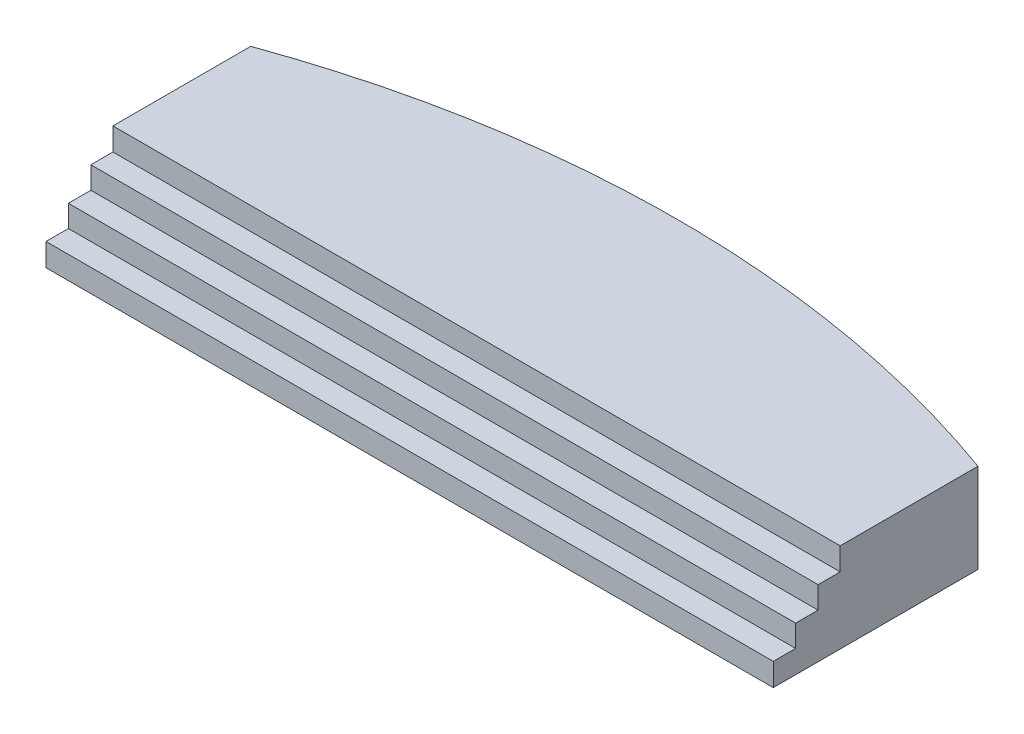
ISO-10303-21;
HEADER;
FILE_DESCRIPTION(('STEP AP214'),'2;1');
FILE_NAME('part.step','',(''),(''),'','','');
FILE_SCHEMA(('AUTOMOTIVE_DESIGN { 1 0 10303 214 1 1 1 1 }'));
ENDSEC;
DATA;
#1=APPLICATION_CONTEXT('core data for automotive mechanical design processes');
#2=APPLICATION_PROTOCOL_DEFINITION('international standard','automotive_design',2000,#1);
#3=PRODUCT_CONTEXT('',#1,'mechanical');
#4=PRODUCT('Part','Part','',(#3));
#5=PRODUCT_RELATED_PRODUCT_CATEGORY('part','',(#4));
#6=PRODUCT_DEFINITION_FORMATION('','',#4);
#7=PRODUCT_DEFINITION_CONTEXT('part definition',#1,'design');
#8=PRODUCT_DEFINITION('design','',#6,#7);
#9=PRODUCT_DEFINITION_SHAPE('','',#8);
#10=(LENGTH_UNIT() NAMED_UNIT(*) SI_UNIT(.MILLI.,.METRE.));
#11=(NAMED_UNIT(*) PLANE_ANGLE_UNIT() SI_UNIT($,.RADIAN.));
#12=(NAMED_UNIT(*) SI_UNIT($,.STERADIAN.) SOLID_ANGLE_UNIT());
#13=UNCERTAINTY_MEASURE_WITH_UNIT(LENGTH_MEASURE(1.E-05),#10,'distance_accuracy_value','');
#14=(GEOMETRIC_REPRESENTATION_CONTEXT(3) GLOBAL_UNCERTAINTY_ASSIGNED_CONTEXT((#13)) GLOBAL_UNIT_ASSIGNED_CONTEXT((#10,
#11,#12)) REPRESENTATION_CONTEXT('',''));
#15=CARTESIAN_POINT('',(0.,0.,0.));
#16=DIRECTION('',(0.,0.,1.));
#17=DIRECTION('',(1.,0.,0.));
#18=AXIS2_PLACEMENT_3D('',#15,#16,#17);
#19=CARTESIAN_POINT('',(-4067.11617207082,1000.,-9000.));
#20=DIRECTION('',(-1.,0.,0.));
#21=DIRECTION('',(0.,0.,1.));
#22=AXIS2_PLACEMENT_3D('',#19,#20,#21);
#23=PLANE('',#22);
#24=DIRECTION('',(0.,-1.,0.));
#25=VECTOR('',#24,1.);
#26=CARTESIAN_POINT('',(-4067.11617207082,1000.,-9748.52702002299));
#27=LINE('',#26,#25);
#28=CARTESIAN_POINT('',(-4067.11617207082,1000.,-9748.52702002299));
#29=VERTEX_POINT('',#28);
#30=CARTESIAN_POINT('',(-4067.11617207082,747.115103927776,-9748.52702002299));
#31=VERTEX_POINT('',#30);
#32=EDGE_CURVE('E185',#29,#31,#27,.T.);
#33=ORIENTED_EDGE('',*,*,#32,.F.);
#34=DIRECTION('',(0.,0.,-1.));
#35=VECTOR('',#34,1.);
#36=CARTESIAN_POINT('',(-4067.11617207082,1000.,-9000.));
#37=LINE('',#36,#35);
#38=CARTESIAN_POINT('',(-4067.11617207082,1000.,-11289.7549150936));
#39=VERTEX_POINT('',#38);
#40=EDGE_CURVE('E68',#29,#39,#37,.T.);
#41=ORIENTED_EDGE('',*,*,#40,.T.);
#42=DIRECTION('',(0.,-1.,0.));
#43=VECTOR('',#42,1.);
#44=CARTESIAN_POINT('',(-4067.11617207082,1000.,-11289.7549150936));
#45=LINE('',#44,#43);
#46=CARTESIAN_POINT('',(-4067.11617207082,0.,-11289.7549150936));
#47=VERTEX_POINT('',#46);
#48=EDGE_CURVE('E226',#39,#47,#45,.T.);
#49=ORIENTED_EDGE('',*,*,#48,.T.);
#50=DIRECTION('',(0.,0.,-1.));
#51=VECTOR('',#50,1.);
#52=CARTESIAN_POINT('',(-4067.11617207082,0.,-9000.));
#53=LINE('',#52,#51);
#54=CARTESIAN_POINT('',(-4067.11617207082,0.,-9000.));
#55=VERTEX_POINT('',#54);
#56=EDGE_CURVE('E139',#55,#47,#53,.T.);
#57=ORIENTED_EDGE('',*,*,#56,.F.);
#58=DIRECTION('',(0.,-1.,0.));
#59=VECTOR('',#58,1.);
#60=CARTESIAN_POINT('',(-4067.11617207082,1000.,-9000.));
#61=LINE('',#60,#59);
#62=CARTESIAN_POINT('',(-4067.11617207082,254.910429711032,-9000.));
#63=VERTEX_POINT('',#62);
#64=EDGE_CURVE('E219',#63,#55,#61,.T.);
#65=ORIENTED_EDGE('',*,*,#64,.F.);
#66=DIRECTION('',(0.,0.,1.));
#67=VECTOR('',#66,1.);
#68=CARTESIAN_POINT('',(-4067.11617207082,254.910429711032,-9000.));
#69=LINE('',#68,#67);
#70=CARTESIAN_POINT('',(-4067.11617207082,254.910429711032,-9250.24574488999));
#71=VERTEX_POINT('',#70);
#72=EDGE_CURVE('E202',#71,#63,#69,.T.);
#73=ORIENTED_EDGE('',*,*,#72,.F.);
#74=DIRECTION('',(0.,-1.,0.));
#75=VECTOR('',#74,1.);
#76=CARTESIAN_POINT('',(-4067.11617207082,1000.,-9250.24574488999));
#77=LINE('',#76,#75);
#78=CARTESIAN_POINT('',(-4067.11617207082,500.,-9250.24574488999));
#79=VERTEX_POINT('',#78);
#80=EDGE_CURVE('E205',#79,#71,#77,.T.);
#81=ORIENTED_EDGE('',*,*,#80,.F.);
#82=DIRECTION('',(0.,0.,1.));
#83=VECTOR('',#82,1.);
#84=CARTESIAN_POINT('',(-4067.11617207082,500.,-9000.));
#85=LINE('',#84,#83);
#86=CARTESIAN_POINT('',(-4067.11617207082,500.,-9501.41191609525));
#87=VERTEX_POINT('',#86);
#88=EDGE_CURVE('E208',#87,#79,#85,.T.);
#89=ORIENTED_EDGE('',*,*,#88,.F.);
#90=DIRECTION('',(0.,-1.,0.));
#91=VECTOR('',#90,1.);
#92=CARTESIAN_POINT('',(-4067.11617207082,1000.,-9501.41191609525));
#93=LINE('',#92,#91);
#94=CARTESIAN_POINT('',(-4067.11617207082,747.115103927776,-9501.41191609525));
#95=VERTEX_POINT('',#94);
#96=EDGE_CURVE('E91',#95,#87,#93,.T.);
#97=ORIENTED_EDGE('',*,*,#96,.F.);
#98=DIRECTION('',(0.,0.,1.));
#99=VECTOR('',#98,1.);
#100=CARTESIAN_POINT('',(-4067.11617207082,747.115103927776,-9000.));
#101=LINE('',#100,#99);
#102=EDGE_CURVE('E84',#31,#95,#101,.T.);
#103=ORIENTED_EDGE('',*,*,#102,.F.);
#104=EDGE_LOOP('',(#33,#41,#49,#57,#65,#73,#81,#89,#97,#103));
#105=FACE_BOUND('',#104,.T.);
#106=ADVANCED_FACE('F45',(#105),#23,.T.);
#107=CARTESIAN_POINT('',(-4067.11617207082,1000.,-9000.));
#108=DIRECTION('',(0.,0.,-1.));
#109=DIRECTION('',(-1.,0.,0.));
#110=AXIS2_PLACEMENT_3D('',#107,#108,#109);
#111=PLANE('',#110);
#112=DIRECTION('',(1.,0.,0.));
#113=VECTOR('',#112,1.);
#114=CARTESIAN_POINT('',(-4067.11617207082,0.,-9000.));
#115=LINE('',#114,#113);
#116=CARTESIAN_POINT('',(4067.11617197438,0.,-9000.));
#117=VERTEX_POINT('',#116);
#118=EDGE_CURVE('E141',#55,#117,#115,.T.);
#119=ORIENTED_EDGE('',*,*,#118,.T.);
#120=DIRECTION('',(0.,-1.,0.));
#121=VECTOR('',#120,1.);
#122=CARTESIAN_POINT('',(4067.11617197438,254.910429711032,-9000.));
#123=LINE('',#122,#121);
#124=CARTESIAN_POINT('',(4067.11617197438,254.910429711032,-9000.));
#125=VERTEX_POINT('',#124);
#126=EDGE_CURVE('E150',#125,#117,#123,.T.);
#127=ORIENTED_EDGE('',*,*,#126,.F.);
#128=DIRECTION('',(1.,0.,0.));
#129=VECTOR('',#128,1.);
#130=CARTESIAN_POINT('',(-20135.8766380256,254.910429711032,-9000.));
#131=LINE('',#130,#129);
#132=EDGE_CURVE('E181',#63,#125,#131,.T.);
#133=ORIENTED_EDGE('',*,*,#132,.F.);
#134=ORIENTED_EDGE('',*,*,#64,.T.);
#135=EDGE_LOOP('',(#119,#127,#133,#134));
#136=FACE_BOUND('',#135,.T.);
#137=ADVANCED_FACE('F240',(#136),#111,.F.);
#138=CARTESIAN_POINT('',(0.,1000.,8.70414851306123E-11));
#139=DIRECTION('',(0.,-1.,0.));
#140=DIRECTION('',(0.,0.,-1.));
#141=AXIS2_PLACEMENT_3D('',#138,#139,#140);
#142=CYLINDRICAL_SURFACE('',#141,12000.0000000001);
#143=CARTESIAN_POINT('',(0.,0.,8.70414851306123E-11));
#144=DIRECTION('',(0.,-1.,0.));
#145=DIRECTION('',(0.,0.,-1.));
#146=AXIS2_PLACEMENT_3D('',#143,#144,#145);
#147=CIRCLE('',#146,12000.0000000001);
#148=CARTESIAN_POINT('',(4067.11617207076,0.,-11289.7549150937));
#149=VERTEX_POINT('',#148);
#150=EDGE_CURVE('E77',#47,#149,#147,.T.);
#151=ORIENTED_EDGE('',*,*,#150,.F.);
#152=ORIENTED_EDGE('',*,*,#48,.F.);
#153=CARTESIAN_POINT('',(0.,1000.,-2.8421709430404E-11));
#154=DIRECTION('',(0.,1.,0.));
#155=DIRECTION('',(0.,0.,1.));
#156=AXIS2_PLACEMENT_3D('',#153,#154,#155);
#157=CIRCLE('',#156,12000.);
#158=CARTESIAN_POINT('',(4067.11617197438,1000.,-11289.7549150937));
#159=VERTEX_POINT('',#158);
#160=EDGE_CURVE('E59',#159,#39,#157,.T.);
#161=ORIENTED_EDGE('',*,*,#160,.F.);
#162=DIRECTION('',(0.,1.,0.));
#163=VECTOR('',#162,1.);
#164=CARTESIAN_POINT('',(4067.11617197438,-3000.,-11289.7549151284));
#165=LINE('',#164,#163);
#166=EDGE_CURVE('E11',#159,#149,#165,.F.);
#167=ORIENTED_EDGE('',*,*,#166,.T.);
#168=EDGE_LOOP('',(#151,#152,#161,#167));
#169=FACE_BOUND('',#168,.T.);
#170=ADVANCED_FACE('F143',(#169),#142,.T.);
#171=CARTESIAN_POINT('',(0.,1000.,-2.8421709430404E-11));
#172=DIRECTION('',(0.,1.,0.));
#173=DIRECTION('',(0.,0.,1.));
#174=AXIS2_PLACEMENT_3D('',#171,#172,#173);
#175=PLANE('',#174);
#176=DIRECTION('',(0.,0.,1.));
#177=VECTOR('',#176,1.);
#178=CARTESIAN_POINT('',(4067.11617197438,1000.,-11360.834064603));
#179=LINE('',#178,#177);
#180=CARTESIAN_POINT('',(4067.11617197438,1000.,-9748.52702002299));
#181=VERTEX_POINT('',#180);
#182=EDGE_CURVE('E152',#159,#181,#179,.T.);
#183=ORIENTED_EDGE('',*,*,#182,.F.);
#184=ORIENTED_EDGE('',*,*,#160,.T.);
#185=ORIENTED_EDGE('',*,*,#40,.F.);
#186=DIRECTION('',(-1.,0.,0.));
#187=VECTOR('',#186,1.);
#188=CARTESIAN_POINT('',(0.,1000.,-9748.52702002299));
#189=LINE('',#188,#187);
#190=EDGE_CURVE('E53',#181,#29,#189,.T.);
#191=ORIENTED_EDGE('',*,*,#190,.F.);
#192=EDGE_LOOP('',(#183,#184,#185,#191));
#193=FACE_BOUND('',#192,.T.);
#194=ADVANCED_FACE('F234',(#193),#175,.T.);
#195=CARTESIAN_POINT('',(0.,0.,-2.8421709430404E-11));
#196=DIRECTION('',(0.,1.,0.));
#197=DIRECTION('',(0.,0.,1.));
#198=AXIS2_PLACEMENT_3D('',#195,#196,#197);
#199=PLANE('',#198);
#200=ORIENTED_EDGE('',*,*,#150,.T.);
#201=DIRECTION('',(0.,0.,-1.));
#202=VECTOR('',#201,1.);
#203=CARTESIAN_POINT('',(4067.11617197438,0.,-9000.));
#204=LINE('',#203,#202);
#205=EDGE_CURVE('E137',#117,#149,#204,.T.);
#206=ORIENTED_EDGE('',*,*,#205,.F.);
#207=ORIENTED_EDGE('',*,*,#118,.F.);
#208=ORIENTED_EDGE('',*,*,#56,.T.);
#209=EDGE_LOOP('',(#200,#206,#207,#208));
#210=FACE_BOUND('',#209,.T.);
#211=ADVANCED_FACE('F134',(#210),#199,.F.);
#212=CARTESIAN_POINT('',(-20135.8766380256,747.115103927776,-9748.52702002299));
#213=DIRECTION('',(0.,0.,-1.));
#214=DIRECTION('',(-1.,0.,0.));
#215=AXIS2_PLACEMENT_3D('',#212,#213,#214);
#216=PLANE('',#215);
#217=ORIENTED_EDGE('',*,*,#32,.T.);
#218=DIRECTION('',(1.,0.,0.));
#219=VECTOR('',#218,1.);
#220=CARTESIAN_POINT('',(-20135.8766380256,747.115103927776,-9748.52702002299));
#221=LINE('',#220,#219);
#222=CARTESIAN_POINT('',(4067.11617197438,747.115103927776,-9748.52702002299));
#223=VERTEX_POINT('',#222);
#224=EDGE_CURVE('E182',#31,#223,#221,.T.);
#225=ORIENTED_EDGE('',*,*,#224,.T.);
#226=DIRECTION('',(0.,-1.,0.));
#227=VECTOR('',#226,1.);
#228=CARTESIAN_POINT('',(4067.11617197438,1000.,-9748.52702002299));
#229=LINE('',#228,#227);
#230=EDGE_CURVE('E156',#181,#223,#229,.T.);
#231=ORIENTED_EDGE('',*,*,#230,.F.);
#232=ORIENTED_EDGE('',*,*,#190,.T.);
#233=EDGE_LOOP('',(#217,#225,#231,#232));
#234=FACE_BOUND('',#233,.T.);
#235=ADVANCED_FACE('F232',(#234),#216,.F.);
#236=CARTESIAN_POINT('',(-20135.8766380256,747.115103927776,-9501.41191609525));
#237=DIRECTION('',(0.,-1.,0.));
#238=DIRECTION('',(0.,0.,-1.));
#239=AXIS2_PLACEMENT_3D('',#236,#237,#238);
#240=PLANE('',#239);
#241=ORIENTED_EDGE('',*,*,#102,.T.);
#242=DIRECTION('',(1.,0.,0.));
#243=VECTOR('',#242,1.);
#244=CARTESIAN_POINT('',(-20135.8766380256,747.115103927776,-9501.41191609525));
#245=LINE('',#244,#243);
#246=CARTESIAN_POINT('',(4067.11617197438,747.115103927776,-9501.41191609525));
#247=VERTEX_POINT('',#246);
#248=EDGE_CURVE('E186',#95,#247,#245,.T.);
#249=ORIENTED_EDGE('',*,*,#248,.T.);
#250=DIRECTION('',(0.,0.,1.));
#251=VECTOR('',#250,1.);
#252=CARTESIAN_POINT('',(4067.11617197438,747.115103927776,-9748.52702002299));
#253=LINE('',#252,#251);
#254=EDGE_CURVE('E165',#223,#247,#253,.T.);
#255=ORIENTED_EDGE('',*,*,#254,.F.);
#256=ORIENTED_EDGE('',*,*,#224,.F.);
#257=EDGE_LOOP('',(#241,#249,#255,#256));
#258=FACE_BOUND('',#257,.T.);
#259=ADVANCED_FACE('F256',(#258),#240,.F.);
#260=CARTESIAN_POINT('',(-20135.8766380256,500.,-9501.41191609525));
#261=DIRECTION('',(0.,0.,-1.));
#262=DIRECTION('',(-1.,0.,0.));
#263=AXIS2_PLACEMENT_3D('',#260,#261,#262);
#264=PLANE('',#263);
#265=ORIENTED_EDGE('',*,*,#96,.T.);
#266=DIRECTION('',(1.,0.,0.));
#267=VECTOR('',#266,1.);
#268=CARTESIAN_POINT('',(-20135.8766380256,500.,-9501.41191609525));
#269=LINE('',#268,#267);
#270=CARTESIAN_POINT('',(4067.11617197438,500.,-9501.41191609525));
#271=VERTEX_POINT('',#270);
#272=EDGE_CURVE('E189',#87,#271,#269,.T.);
#273=ORIENTED_EDGE('',*,*,#272,.T.);
#274=DIRECTION('',(0.,-1.,0.));
#275=VECTOR('',#274,1.);
#276=CARTESIAN_POINT('',(4067.11617197438,747.115103927776,-9501.41191609525));
#277=LINE('',#276,#275);
#278=EDGE_CURVE('E169',#247,#271,#277,.T.);
#279=ORIENTED_EDGE('',*,*,#278,.F.);
#280=ORIENTED_EDGE('',*,*,#248,.F.);
#281=EDGE_LOOP('',(#265,#273,#279,#280));
#282=FACE_BOUND('',#281,.T.);
#283=ADVANCED_FACE('F254',(#282),#264,.F.);
#284=CARTESIAN_POINT('',(-20135.8766380256,500.,-9250.24574488999));
#285=DIRECTION('',(0.,-1.,0.));
#286=DIRECTION('',(0.,0.,-1.));
#287=AXIS2_PLACEMENT_3D('',#284,#285,#286);
#288=PLANE('',#287);
#289=ORIENTED_EDGE('',*,*,#88,.T.);
#290=DIRECTION('',(1.,0.,0.));
#291=VECTOR('',#290,1.);
#292=CARTESIAN_POINT('',(-20135.8766380256,500.,-9250.24574488999));
#293=LINE('',#292,#291);
#294=CARTESIAN_POINT('',(4067.11617197438,500.,-9250.24574488999));
#295=VERTEX_POINT('',#294);
#296=EDGE_CURVE('E192',#79,#295,#293,.T.);
#297=ORIENTED_EDGE('',*,*,#296,.T.);
#298=DIRECTION('',(0.,0.,1.));
#299=VECTOR('',#298,1.);
#300=CARTESIAN_POINT('',(4067.11617197438,500.,-9501.41191609525));
#301=LINE('',#300,#299);
#302=EDGE_CURVE('E173',#271,#295,#301,.T.);
#303=ORIENTED_EDGE('',*,*,#302,.F.);
#304=ORIENTED_EDGE('',*,*,#272,.F.);
#305=EDGE_LOOP('',(#289,#297,#303,#304));
#306=FACE_BOUND('',#305,.T.);
#307=ADVANCED_FACE('F252',(#306),#288,.F.);
#308=CARTESIAN_POINT('',(-20135.8766380256,254.910429711032,-9250.24574488999));
#309=DIRECTION('',(0.,0.,-1.));
#310=DIRECTION('',(-1.,0.,0.));
#311=AXIS2_PLACEMENT_3D('',#308,#309,#310);
#312=PLANE('',#311);
#313=ORIENTED_EDGE('',*,*,#80,.T.);
#314=DIRECTION('',(1.,0.,0.));
#315=VECTOR('',#314,1.);
#316=CARTESIAN_POINT('',(-20135.8766380256,254.910429711032,-9250.24574488999));
#317=LINE('',#316,#315);
#318=CARTESIAN_POINT('',(4067.11617197438,254.910429711032,-9250.24574488999));
#319=VERTEX_POINT('',#318);
#320=EDGE_CURVE('E195',#71,#319,#317,.T.);
#321=ORIENTED_EDGE('',*,*,#320,.T.);
#322=DIRECTION('',(0.,-1.,0.));
#323=VECTOR('',#322,1.);
#324=CARTESIAN_POINT('',(4067.11617197438,500.,-9250.24574488999));
#325=LINE('',#324,#323);
#326=EDGE_CURVE('E177',#295,#319,#325,.T.);
#327=ORIENTED_EDGE('',*,*,#326,.F.);
#328=ORIENTED_EDGE('',*,*,#296,.F.);
#329=EDGE_LOOP('',(#313,#321,#327,#328));
#330=FACE_BOUND('',#329,.T.);
#331=ADVANCED_FACE('F247',(#330),#312,.F.);
#332=CARTESIAN_POINT('',(-20135.8766380256,254.910429711032,-9000.));
#333=DIRECTION('',(0.,-1.,0.));
#334=DIRECTION('',(0.,0.,-1.));
#335=AXIS2_PLACEMENT_3D('',#332,#333,#334);
#336=PLANE('',#335);
#337=ORIENTED_EDGE('',*,*,#72,.T.);
#338=ORIENTED_EDGE('',*,*,#132,.T.);
#339=DIRECTION('',(0.,0.,1.));
#340=VECTOR('',#339,1.);
#341=CARTESIAN_POINT('',(4067.11617197438,254.910429711032,-9250.24574488999));
#342=LINE('',#341,#340);
#343=EDGE_CURVE('E158',#319,#125,#342,.T.);
#344=ORIENTED_EDGE('',*,*,#343,.F.);
#345=ORIENTED_EDGE('',*,*,#320,.F.);
#346=EDGE_LOOP('',(#337,#338,#344,#345));
#347=FACE_BOUND('',#346,.T.);
#348=ADVANCED_FACE('F243',(#347),#336,.F.);
#349=CARTESIAN_POINT('',(4067.11617197438,0.,0.));
#350=DIRECTION('',(1.,0.,0.));
#351=DIRECTION('',(0.,0.,-1.));
#352=AXIS2_PLACEMENT_3D('',#349,#350,#351);
#353=PLANE('',#352);
#354=ORIENTED_EDGE('',*,*,#166,.F.);
#355=ORIENTED_EDGE('',*,*,#182,.T.);
#356=ORIENTED_EDGE('',*,*,#230,.T.);
#357=ORIENTED_EDGE('',*,*,#254,.T.);
#358=ORIENTED_EDGE('',*,*,#278,.T.);
#359=ORIENTED_EDGE('',*,*,#302,.T.);
#360=ORIENTED_EDGE('',*,*,#326,.T.);
#361=ORIENTED_EDGE('',*,*,#343,.T.);
#362=ORIENTED_EDGE('',*,*,#126,.T.);
#363=ORIENTED_EDGE('',*,*,#205,.T.);
#364=EDGE_LOOP('',(#354,#355,#356,#357,#358,#359,#360,#361,#362,#363));
#365=FACE_BOUND('',#364,.T.);
#366=ADVANCED_FACE('F147',(#365),#353,.T.);
#367=CLOSED_SHELL('',(#106,#137,#170,#194,#211,#235,#259,#283,#307,#331,#348,#366));
#368=MANIFOLD_SOLID_BREP('B2',#367);
#369=ADVANCED_BREP_SHAPE_REPRESENTATION('',(#18,#368),#14);
#370=SHAPE_DEFINITION_REPRESENTATION(#9,#369);
ENDSEC;
END-ISO-10303-21;
